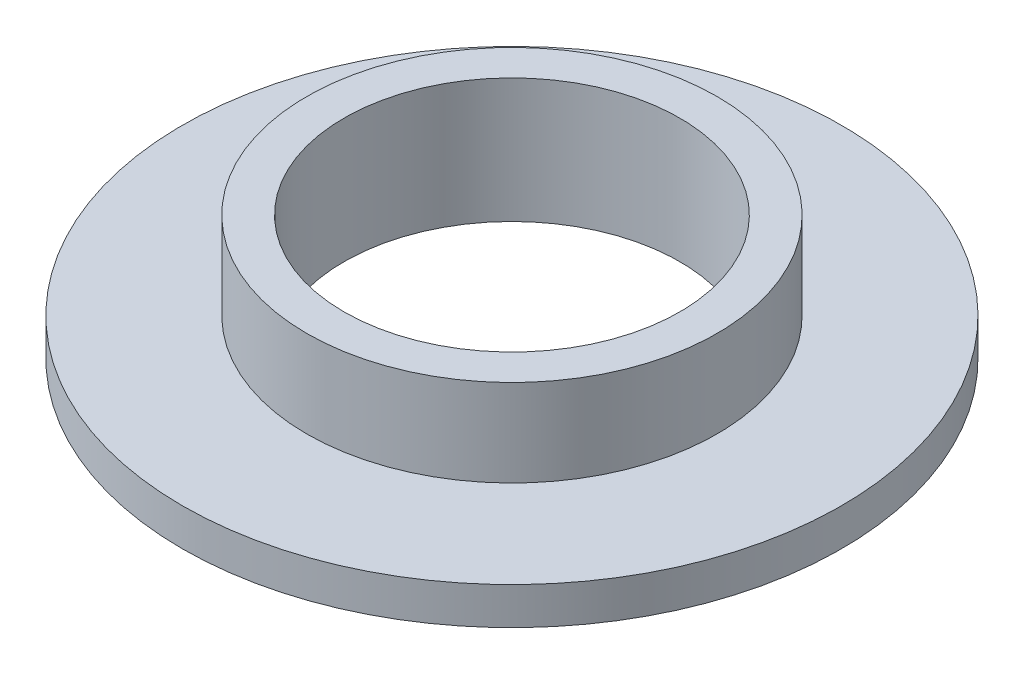
ISO-10303-21;
HEADER;
FILE_DESCRIPTION(('STEP AP214'),'2;1');
FILE_NAME('part.step','',(''),(''),'','','');
FILE_SCHEMA(('AUTOMOTIVE_DESIGN { 1 0 10303 214 1 1 1 1 }'));
ENDSEC;
DATA;
#1=APPLICATION_CONTEXT('core data for automotive mechanical design processes');
#2=APPLICATION_PROTOCOL_DEFINITION('international standard','automotive_design',2000,#1);
#3=PRODUCT_CONTEXT('',#1,'mechanical');
#4=PRODUCT('Part','Part','',(#3));
#5=PRODUCT_RELATED_PRODUCT_CATEGORY('part','',(#4));
#6=PRODUCT_DEFINITION_FORMATION('','',#4);
#7=PRODUCT_DEFINITION_CONTEXT('part definition',#1,'design');
#8=PRODUCT_DEFINITION('design','',#6,#7);
#9=PRODUCT_DEFINITION_SHAPE('','',#8);
#10=(LENGTH_UNIT() NAMED_UNIT(*) SI_UNIT(.MILLI.,.METRE.));
#11=(NAMED_UNIT(*) PLANE_ANGLE_UNIT() SI_UNIT($,.RADIAN.));
#12=(NAMED_UNIT(*) SI_UNIT($,.STERADIAN.) SOLID_ANGLE_UNIT());
#13=UNCERTAINTY_MEASURE_WITH_UNIT(LENGTH_MEASURE(1.E-05),#10,'distance_accuracy_value','');
#14=(GEOMETRIC_REPRESENTATION_CONTEXT(3) GLOBAL_UNCERTAINTY_ASSIGNED_CONTEXT((#13)) GLOBAL_UNIT_ASSIGNED_CONTEXT((#10,
#11,#12)) REPRESENTATION_CONTEXT('',''));
#15=CARTESIAN_POINT('',(0.,0.,0.));
#16=DIRECTION('',(0.,0.,1.));
#17=DIRECTION('',(1.,0.,0.));
#18=AXIS2_PLACEMENT_3D('',#15,#16,#17);
#19=CARTESIAN_POINT('',(0.,10.,0.));
#20=DIRECTION('',(0.,-1.,0.));
#21=DIRECTION('',(0.,0.,-1.));
#22=AXIS2_PLACEMENT_3D('',#19,#20,#21);
#23=CYLINDRICAL_SURFACE('',#22,13.5);
#24=CARTESIAN_POINT('',(0.,10.,0.));
#25=DIRECTION('',(0.,1.,0.));
#26=DIRECTION('',(0.,0.,1.));
#27=AXIS2_PLACEMENT_3D('',#24,#25,#26);
#28=CIRCLE('',#27,13.5);
#29=CARTESIAN_POINT('',(0.,10.,13.5));
#30=VERTEX_POINT('',#29);
#31=EDGE_CURVE('E53',#30,#30,#28,.T.);
#32=ORIENTED_EDGE('',*,*,#31,.T.);
#33=EDGE_LOOP('',(#32));
#34=FACE_BOUND('',#33,.T.);
#35=CARTESIAN_POINT('',(0.,0.,0.));
#36=DIRECTION('',(0.,1.,0.));
#37=DIRECTION('',(0.,0.,1.));
#38=AXIS2_PLACEMENT_3D('',#35,#36,#37);
#39=CIRCLE('',#38,13.5);
#40=CARTESIAN_POINT('',(0.,0.,13.5));
#41=VERTEX_POINT('',#40);
#42=EDGE_CURVE('E48',#41,#41,#39,.T.);
#43=ORIENTED_EDGE('',*,*,#42,.F.);
#44=EDGE_LOOP('',(#43));
#45=FACE_BOUND('',#44,.T.);
#46=ADVANCED_FACE('F45',(#34,#45),#23,.F.);
#47=CARTESIAN_POINT('',(0.,10.,0.));
#48=DIRECTION('',(0.,-1.,0.));
#49=DIRECTION('',(0.,0.,-1.));
#50=AXIS2_PLACEMENT_3D('',#47,#48,#49);
#51=CYLINDRICAL_SURFACE('',#50,16.5);
#52=CARTESIAN_POINT('',(0.,3.,0.));
#53=DIRECTION('',(0.,1.,0.));
#54=DIRECTION('',(0.,0.,1.));
#55=AXIS2_PLACEMENT_3D('',#52,#53,#54);
#56=CIRCLE('',#55,16.5);
#57=CARTESIAN_POINT('',(0.,3.,16.5));
#58=VERTEX_POINT('',#57);
#59=EDGE_CURVE('E64',#58,#58,#56,.T.);
#60=ORIENTED_EDGE('',*,*,#59,.T.);
#61=EDGE_LOOP('',(#60));
#62=FACE_BOUND('',#61,.T.);
#63=CARTESIAN_POINT('',(0.,10.,0.));
#64=DIRECTION('',(0.,1.,0.));
#65=DIRECTION('',(0.,0.,1.));
#66=AXIS2_PLACEMENT_3D('',#63,#64,#65);
#67=CIRCLE('',#66,16.5);
#68=CARTESIAN_POINT('',(0.,10.,16.5));
#69=VERTEX_POINT('',#68);
#70=EDGE_CURVE('E10',#69,#69,#67,.T.);
#71=ORIENTED_EDGE('',*,*,#70,.F.);
#72=EDGE_LOOP('',(#71));
#73=FACE_BOUND('',#72,.T.);
#74=ADVANCED_FACE('F73',(#62,#73),#51,.T.);
#75=CARTESIAN_POINT('',(0.,10.,0.));
#76=DIRECTION('',(0.,1.,0.));
#77=DIRECTION('',(0.,0.,1.));
#78=AXIS2_PLACEMENT_3D('',#75,#76,#77);
#79=PLANE('',#78);
#80=ORIENTED_EDGE('',*,*,#31,.F.);
#81=EDGE_LOOP('',(#80));
#82=FACE_BOUND('',#81,.T.);
#83=ORIENTED_EDGE('',*,*,#70,.T.);
#84=EDGE_LOOP('',(#83));
#85=FACE_BOUND('',#84,.T.);
#86=ADVANCED_FACE('F90',(#82,#85),#79,.T.);
#87=CARTESIAN_POINT('',(0.,0.,0.));
#88=DIRECTION('',(0.,1.,0.));
#89=DIRECTION('',(0.,0.,1.));
#90=AXIS2_PLACEMENT_3D('',#87,#88,#89);
#91=PLANE('',#90);
#92=ORIENTED_EDGE('',*,*,#42,.T.);
#93=EDGE_LOOP('',(#92));
#94=FACE_BOUND('',#93,.T.);
#95=CARTESIAN_POINT('',(0.,0.,0.));
#96=DIRECTION('',(0.,1.,0.));
#97=DIRECTION('',(0.,0.,1.));
#98=AXIS2_PLACEMENT_3D('',#95,#96,#97);
#99=CIRCLE('',#98,26.5);
#100=CARTESIAN_POINT('',(0.,0.,26.5));
#101=VERTEX_POINT('',#100);
#102=EDGE_CURVE('E60',#101,#101,#99,.T.);
#103=ORIENTED_EDGE('',*,*,#102,.F.);
#104=EDGE_LOOP('',(#103));
#105=FACE_BOUND('',#104,.T.);
#106=ADVANCED_FACE('F85',(#94,#105),#91,.F.);
#107=CARTESIAN_POINT('',(0.,3.,0.));
#108=DIRECTION('',(0.,-1.,0.));
#109=DIRECTION('',(0.,0.,-1.));
#110=AXIS2_PLACEMENT_3D('',#107,#108,#109);
#111=CYLINDRICAL_SURFACE('',#110,26.5);
#112=CARTESIAN_POINT('',(0.,3.,0.));
#113=DIRECTION('',(0.,1.,0.));
#114=DIRECTION('',(0.,0.,1.));
#115=AXIS2_PLACEMENT_3D('',#112,#113,#114);
#116=CIRCLE('',#115,26.5);
#117=CARTESIAN_POINT('',(0.,3.,26.5));
#118=VERTEX_POINT('',#117);
#119=EDGE_CURVE('E65',#118,#118,#116,.T.);
#120=ORIENTED_EDGE('',*,*,#119,.F.);
#121=EDGE_LOOP('',(#120));
#122=FACE_BOUND('',#121,.T.);
#123=ORIENTED_EDGE('',*,*,#102,.T.);
#124=EDGE_LOOP('',(#123));
#125=FACE_BOUND('',#124,.T.);
#126=ADVANCED_FACE('F79',(#122,#125),#111,.T.);
#127=CARTESIAN_POINT('',(0.,3.,0.));
#128=DIRECTION('',(0.,1.,0.));
#129=DIRECTION('',(0.,0.,1.));
#130=AXIS2_PLACEMENT_3D('',#127,#128,#129);
#131=PLANE('',#130);
#132=ORIENTED_EDGE('',*,*,#59,.F.);
#133=EDGE_LOOP('',(#132));
#134=FACE_BOUND('',#133,.T.);
#135=ORIENTED_EDGE('',*,*,#119,.T.);
#136=EDGE_LOOP('',(#135));
#137=FACE_BOUND('',#136,.T.);
#138=ADVANCED_FACE('F76',(#134,#137),#131,.T.);
#139=CLOSED_SHELL('',(#46,#74,#86,#106,#126,#138));
#140=MANIFOLD_SOLID_BREP('B2',#139);
#141=ADVANCED_BREP_SHAPE_REPRESENTATION('',(#18,#140),#14);
#142=SHAPE_DEFINITION_REPRESENTATION(#9,#141);
ENDSEC;
END-ISO-10303-21;
